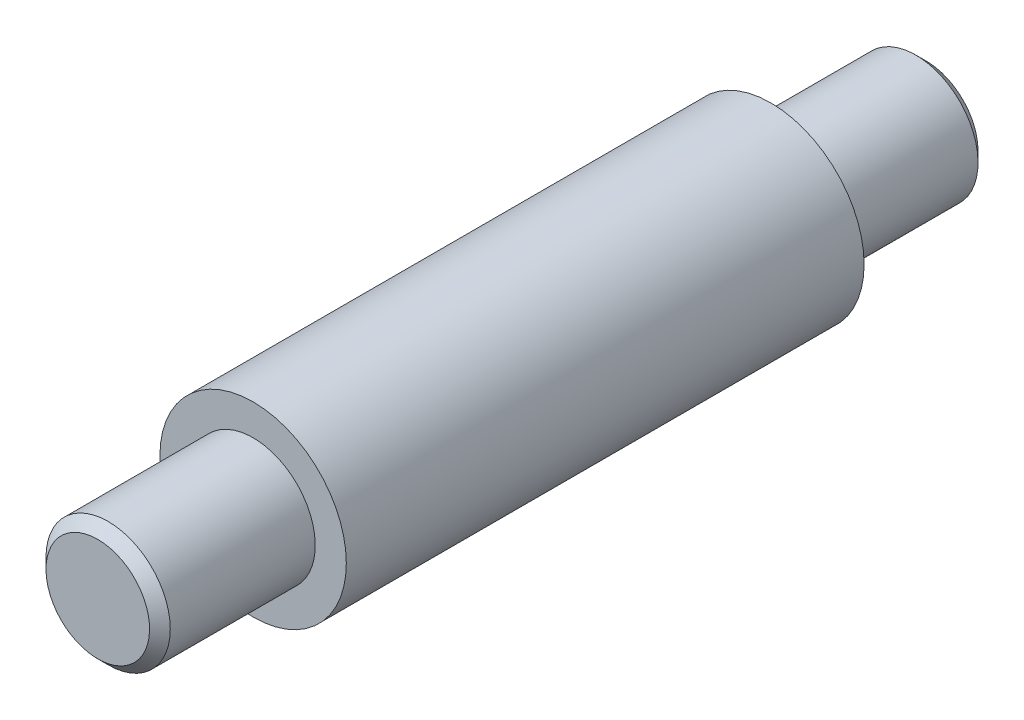
ISO-10303-21;
HEADER;
FILE_DESCRIPTION(('STEP AP214'),'2;1');
FILE_NAME('part.step','',(''),(''),'','','');
FILE_SCHEMA(('AUTOMOTIVE_DESIGN { 1 0 10303 214 1 1 1 1 }'));
ENDSEC;
DATA;
#1=APPLICATION_CONTEXT('core data for automotive mechanical design processes');
#2=APPLICATION_PROTOCOL_DEFINITION('international standard','automotive_design',2000,#1);
#3=PRODUCT_CONTEXT('',#1,'mechanical');
#4=PRODUCT('Part','Part','',(#3));
#5=PRODUCT_RELATED_PRODUCT_CATEGORY('part','',(#4));
#6=PRODUCT_DEFINITION_FORMATION('','',#4);
#7=PRODUCT_DEFINITION_CONTEXT('part definition',#1,'design');
#8=PRODUCT_DEFINITION('design','',#6,#7);
#9=PRODUCT_DEFINITION_SHAPE('','',#8);
#10=(LENGTH_UNIT() NAMED_UNIT(*) SI_UNIT(.MILLI.,.METRE.));
#11=(NAMED_UNIT(*) PLANE_ANGLE_UNIT() SI_UNIT($,.RADIAN.));
#12=(NAMED_UNIT(*) SI_UNIT($,.STERADIAN.) SOLID_ANGLE_UNIT());
#13=UNCERTAINTY_MEASURE_WITH_UNIT(LENGTH_MEASURE(1.E-05),#10,'distance_accuracy_value','');
#14=(GEOMETRIC_REPRESENTATION_CONTEXT(3) GLOBAL_UNCERTAINTY_ASSIGNED_CONTEXT((#13)) GLOBAL_UNIT_ASSIGNED_CONTEXT((#10,
#11,#12)) REPRESENTATION_CONTEXT('',''));
#15=CARTESIAN_POINT('',(0.,0.,0.));
#16=DIRECTION('',(0.,0.,1.));
#17=DIRECTION('',(1.,0.,0.));
#18=AXIS2_PLACEMENT_3D('',#15,#16,#17);
#19=CARTESIAN_POINT('',(0.,0.,-40.));
#20=DIRECTION('',(0.,0.,1.));
#21=DIRECTION('',(0.,-1.,0.));
#22=AXIS2_PLACEMENT_3D('',#19,#20,#21);
#23=PLANE('',#22);
#24=CARTESIAN_POINT('',(0.,0.,-40.));
#25=DIRECTION('',(0.,0.,1.));
#26=DIRECTION('',(0.,-1.,0.));
#27=AXIS2_PLACEMENT_3D('',#24,#25,#26);
#28=CIRCLE('',#27,4.99999999999998);
#29=CARTESIAN_POINT('',(0.,-4.99999999999998,-40.));
#30=VERTEX_POINT('',#29);
#31=EDGE_CURVE('E48',#30,#30,#28,.F.);
#32=ORIENTED_EDGE('',*,*,#31,.T.);
#33=EDGE_LOOP('',(#32));
#34=FACE_BOUND('',#33,.T.);
#35=ADVANCED_FACE('F36',(#34),#23,.F.);
#36=CARTESIAN_POINT('',(0.,0.,25.));
#37=DIRECTION('',(0.,0.,1.));
#38=DIRECTION('',(0.,-1.,0.));
#39=AXIS2_PLACEMENT_3D('',#36,#37,#38);
#40=CYLINDRICAL_SURFACE('',#39,6.);
#41=CARTESIAN_POINT('',(0.,0.,-39.));
#42=DIRECTION('',(0.,0.,1.));
#43=DIRECTION('',(0.,-1.,0.));
#44=AXIS2_PLACEMENT_3D('',#41,#42,#43);
#45=CIRCLE('',#44,6.);
#46=CARTESIAN_POINT('',(0.,-6.,-39.));
#47=VERTEX_POINT('',#46);
#48=EDGE_CURVE('E52',#47,#47,#45,.T.);
#49=ORIENTED_EDGE('',*,*,#48,.T.);
#50=EDGE_LOOP('',(#49));
#51=FACE_BOUND('',#50,.T.);
#52=CARTESIAN_POINT('',(0.,0.,-25.));
#53=DIRECTION('',(0.,0.,1.));
#54=DIRECTION('',(0.,-1.,0.));
#55=AXIS2_PLACEMENT_3D('',#52,#53,#54);
#56=CIRCLE('',#55,6.);
#57=CARTESIAN_POINT('',(0.,-6.,-25.));
#58=VERTEX_POINT('',#57);
#59=EDGE_CURVE('E57',#58,#58,#56,.T.);
#60=ORIENTED_EDGE('',*,*,#59,.F.);
#61=EDGE_LOOP('',(#60));
#62=FACE_BOUND('',#61,.T.);
#63=ADVANCED_FACE('F87',(#51,#62),#40,.T.);
#64=CARTESIAN_POINT('',(0.,6.,-25.));
#65=DIRECTION('',(0.,0.,1.));
#66=DIRECTION('',(0.,-1.,0.));
#67=AXIS2_PLACEMENT_3D('',#64,#65,#66);
#68=PLANE('',#67);
#69=CARTESIAN_POINT('',(0.,0.,-25.));
#70=DIRECTION('',(0.,0.,1.));
#71=DIRECTION('',(0.,-1.,0.));
#72=AXIS2_PLACEMENT_3D('',#69,#70,#71);
#73=CIRCLE('',#72,9.);
#74=CARTESIAN_POINT('',(0.,-9.,-25.));
#75=VERTEX_POINT('',#74);
#76=EDGE_CURVE('E60',#75,#75,#73,.T.);
#77=ORIENTED_EDGE('',*,*,#76,.F.);
#78=EDGE_LOOP('',(#77));
#79=FACE_BOUND('',#78,.T.);
#80=ORIENTED_EDGE('',*,*,#59,.T.);
#81=EDGE_LOOP('',(#80));
#82=FACE_BOUND('',#81,.T.);
#83=ADVANCED_FACE('F81',(#79,#82),#68,.F.);
#84=CARTESIAN_POINT('',(0.,0.,25.));
#85=DIRECTION('',(0.,0.,1.));
#86=DIRECTION('',(0.,-1.,0.));
#87=AXIS2_PLACEMENT_3D('',#84,#85,#86);
#88=CYLINDRICAL_SURFACE('',#87,9.);
#89=CARTESIAN_POINT('',(0.,0.,25.));
#90=DIRECTION('',(0.,0.,1.));
#91=DIRECTION('',(0.,-1.,0.));
#92=AXIS2_PLACEMENT_3D('',#89,#90,#91);
#93=CIRCLE('',#92,9.);
#94=CARTESIAN_POINT('',(0.,-9.,25.));
#95=VERTEX_POINT('',#94);
#96=EDGE_CURVE('E63',#95,#95,#93,.T.);
#97=ORIENTED_EDGE('',*,*,#96,.F.);
#98=EDGE_LOOP('',(#97));
#99=FACE_BOUND('',#98,.T.);
#100=ORIENTED_EDGE('',*,*,#76,.T.);
#101=EDGE_LOOP('',(#100));
#102=FACE_BOUND('',#101,.T.);
#103=ADVANCED_FACE('F75',(#99,#102),#88,.T.);
#104=CARTESIAN_POINT('',(0.,6.,25.));
#105=DIRECTION('',(0.,0.,-1.));
#106=DIRECTION('',(0.,1.,0.));
#107=AXIS2_PLACEMENT_3D('',#104,#105,#106);
#108=PLANE('',#107);
#109=CARTESIAN_POINT('',(0.,0.,25.));
#110=DIRECTION('',(0.,0.,1.));
#111=DIRECTION('',(0.,-1.,0.));
#112=AXIS2_PLACEMENT_3D('',#109,#110,#111);
#113=CIRCLE('',#112,6.);
#114=CARTESIAN_POINT('',(0.,-6.,25.));
#115=VERTEX_POINT('',#114);
#116=EDGE_CURVE('E66',#115,#115,#113,.T.);
#117=ORIENTED_EDGE('',*,*,#116,.F.);
#118=EDGE_LOOP('',(#117));
#119=FACE_BOUND('',#118,.T.);
#120=ORIENTED_EDGE('',*,*,#96,.T.);
#121=EDGE_LOOP('',(#120));
#122=FACE_BOUND('',#121,.T.);
#123=ADVANCED_FACE('F72',(#119,#122),#108,.F.);
#124=CARTESIAN_POINT('',(0.,0.,25.));
#125=DIRECTION('',(0.,0.,1.));
#126=DIRECTION('',(0.,-1.,0.));
#127=AXIS2_PLACEMENT_3D('',#124,#125,#126);
#128=CYLINDRICAL_SURFACE('',#127,6.);
#129=CARTESIAN_POINT('',(0.,0.,39.));
#130=DIRECTION('',(0.,0.,-1.));
#131=DIRECTION('',(0.,1.,0.));
#132=AXIS2_PLACEMENT_3D('',#129,#130,#131);
#133=CIRCLE('',#132,6.);
#134=CARTESIAN_POINT('',(0.,6.00000000000001,39.));
#135=VERTEX_POINT('',#134);
#136=EDGE_CURVE('E10',#135,#135,#133,.T.);
#137=ORIENTED_EDGE('',*,*,#136,.T.);
#138=EDGE_LOOP('',(#137));
#139=FACE_BOUND('',#138,.T.);
#140=ORIENTED_EDGE('',*,*,#116,.T.);
#141=EDGE_LOOP('',(#140));
#142=FACE_BOUND('',#141,.T.);
#143=ADVANCED_FACE('F70',(#139,#142),#128,.T.);
#144=CARTESIAN_POINT('',(0.,0.,40.));
#145=DIRECTION('',(0.,0.,-1.));
#146=DIRECTION('',(0.,1.,0.));
#147=AXIS2_PLACEMENT_3D('',#144,#145,#146);
#148=PLANE('',#147);
#149=CARTESIAN_POINT('',(0.,0.,40.));
#150=DIRECTION('',(0.,0.,-1.));
#151=DIRECTION('',(0.,1.,0.));
#152=AXIS2_PLACEMENT_3D('',#149,#150,#151);
#153=CIRCLE('',#152,4.99999999999999);
#154=CARTESIAN_POINT('',(0.,4.99999999999999,40.));
#155=VERTEX_POINT('',#154);
#156=EDGE_CURVE('E44',#155,#155,#153,.F.);
#157=ORIENTED_EDGE('',*,*,#156,.T.);
#158=EDGE_LOOP('',(#157));
#159=FACE_BOUND('',#158,.T.);
#160=ADVANCED_FACE('F104',(#159),#148,.F.);
#161=CARTESIAN_POINT('',(0.,0.,-39.));
#162=DIRECTION('',(0.,0.,1.));
#163=DIRECTION('',(0.,-1.,0.));
#164=AXIS2_PLACEMENT_3D('',#161,#162,#163);
#165=CONICAL_SURFACE('',#164,6.,0.785398163397456);
#166=ORIENTED_EDGE('',*,*,#31,.F.);
#167=EDGE_LOOP('',(#166));
#168=FACE_BOUND('',#167,.T.);
#169=ORIENTED_EDGE('',*,*,#48,.F.);
#170=EDGE_LOOP('',(#169));
#171=FACE_BOUND('',#170,.T.);
#172=ADVANCED_FACE('F100',(#168,#171),#165,.T.);
#173=CARTESIAN_POINT('',(0.,0.,40.));
#174=DIRECTION('',(0.,0.,-1.));
#175=DIRECTION('',(0.,1.,0.));
#176=AXIS2_PLACEMENT_3D('',#173,#174,#175);
#177=CONICAL_SURFACE('',#176,4.99999999999999,0.785398163397447);
#178=ORIENTED_EDGE('',*,*,#136,.F.);
#179=EDGE_LOOP('',(#178));
#180=FACE_BOUND('',#179,.T.);
#181=ORIENTED_EDGE('',*,*,#156,.F.);
#182=EDGE_LOOP('',(#181));
#183=FACE_BOUND('',#182,.T.);
#184=ADVANCED_FACE('F39',(#180,#183),#177,.T.);
#185=CLOSED_SHELL('',(#35,#63,#83,#103,#123,#143,#160,#172,#184));
#186=MANIFOLD_SOLID_BREP('B2',#185);
#187=ADVANCED_BREP_SHAPE_REPRESENTATION('',(#18,#186),#14);
#188=SHAPE_DEFINITION_REPRESENTATION(#9,#187);
ENDSEC;
END-ISO-10303-21;
